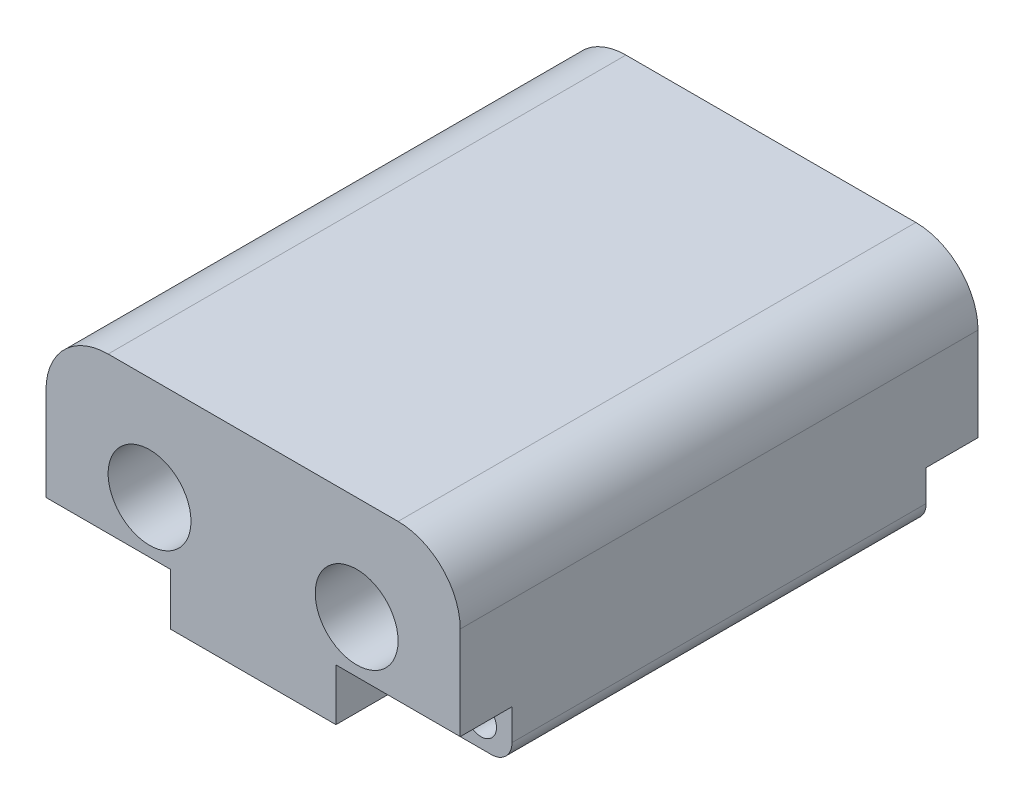
ISO-10303-21;
HEADER;
FILE_DESCRIPTION(('STEP AP214'),'2;1');
FILE_NAME('part.step','',(''),(''),'','','');
FILE_SCHEMA(('AUTOMOTIVE_DESIGN { 1 0 10303 214 1 1 1 1 }'));
ENDSEC;
DATA;
#1=APPLICATION_CONTEXT('core data for automotive mechanical design processes');
#2=APPLICATION_PROTOCOL_DEFINITION('international standard','automotive_design',2000,#1);
#3=PRODUCT_CONTEXT('',#1,'mechanical');
#4=PRODUCT('Part','Part','',(#3));
#5=PRODUCT_RELATED_PRODUCT_CATEGORY('part','',(#4));
#6=PRODUCT_DEFINITION_FORMATION('','',#4);
#7=PRODUCT_DEFINITION_CONTEXT('part definition',#1,'design');
#8=PRODUCT_DEFINITION('design','',#6,#7);
#9=PRODUCT_DEFINITION_SHAPE('','',#8);
#10=(LENGTH_UNIT() NAMED_UNIT(*) SI_UNIT(.MILLI.,.METRE.));
#11=(NAMED_UNIT(*) PLANE_ANGLE_UNIT() SI_UNIT($,.RADIAN.));
#12=(NAMED_UNIT(*) SI_UNIT($,.STERADIAN.) SOLID_ANGLE_UNIT());
#13=UNCERTAINTY_MEASURE_WITH_UNIT(LENGTH_MEASURE(1.E-05),#10,'distance_accuracy_value','');
#14=(GEOMETRIC_REPRESENTATION_CONTEXT(3) GLOBAL_UNCERTAINTY_ASSIGNED_CONTEXT((#13)) GLOBAL_UNIT_ASSIGNED_CONTEXT((#10,
#11,#12)) REPRESENTATION_CONTEXT('',''));
#15=CARTESIAN_POINT('',(0.,0.,0.));
#16=DIRECTION('',(0.,0.,1.));
#17=DIRECTION('',(1.,0.,0.));
#18=AXIS2_PLACEMENT_3D('',#15,#16,#17);
#19=CARTESIAN_POINT('',(0.,0.,0.));
#20=DIRECTION('',(0.,0.,1.));
#21=DIRECTION('',(1.,0.,0.));
#22=AXIS2_PLACEMENT_3D('',#19,#20,#21);
#23=PLANE('',#22);
#24=CARTESIAN_POINT('',(-10.,0.,0.));
#25=DIRECTION('',(0.,0.,1.));
#26=DIRECTION('',(1.,0.,0.));
#27=AXIS2_PLACEMENT_3D('',#24,#25,#26);
#28=CIRCLE('',#27,4.);
#29=CARTESIAN_POINT('',(-6.,0.,0.));
#30=VERTEX_POINT('',#29);
#31=EDGE_CURVE('E299',#30,#30,#28,.T.);
#32=ORIENTED_EDGE('',*,*,#31,.T.);
#33=EDGE_LOOP('',(#32));
#34=FACE_BOUND('',#33,.T.);
#35=CARTESIAN_POINT('',(9.99999999999999,0.,0.));
#36=DIRECTION('',(0.,0.,1.));
#37=DIRECTION('',(1.,0.,0.));
#38=AXIS2_PLACEMENT_3D('',#35,#36,#37);
#39=CIRCLE('',#38,4.);
#40=CARTESIAN_POINT('',(14.,0.,0.));
#41=VERTEX_POINT('',#40);
#42=EDGE_CURVE('E273',#41,#41,#39,.T.);
#43=ORIENTED_EDGE('',*,*,#42,.T.);
#44=EDGE_LOOP('',(#43));
#45=FACE_BOUND('',#44,.T.);
#46=DIRECTION('',(-1.,0.,0.));
#47=VECTOR('',#46,1.);
#48=CARTESIAN_POINT('',(-20.,10.,0.));
#49=LINE('',#48,#47);
#50=CARTESIAN_POINT('',(14.,10.,0.));
#51=VERTEX_POINT('',#50);
#52=CARTESIAN_POINT('',(-14.,10.,0.));
#53=VERTEX_POINT('',#52);
#54=EDGE_CURVE('E323',#51,#53,#49,.T.);
#55=ORIENTED_EDGE('',*,*,#54,.F.);
#56=CARTESIAN_POINT('',(14.,4.00000000000001,0.));
#57=DIRECTION('',(0.,0.,1.));
#58=DIRECTION('',(1.,0.,0.));
#59=AXIS2_PLACEMENT_3D('',#56,#57,#58);
#60=CIRCLE('',#59,6.);
#61=CARTESIAN_POINT('',(20.,4.00000000000001,0.));
#62=VERTEX_POINT('',#61);
#63=EDGE_CURVE('E335',#51,#62,#60,.F.);
#64=ORIENTED_EDGE('',*,*,#63,.T.);
#65=DIRECTION('',(0.,1.,0.));
#66=VECTOR('',#65,1.);
#67=CARTESIAN_POINT('',(20.,10.,0.));
#68=LINE('',#67,#66);
#69=CARTESIAN_POINT('',(20.,-5.,0.));
#70=VERTEX_POINT('',#69);
#71=EDGE_CURVE('E305',#70,#62,#68,.T.);
#72=ORIENTED_EDGE('',*,*,#71,.F.);
#73=DIRECTION('',(-1.,0.,0.));
#74=VECTOR('',#73,1.);
#75=CARTESIAN_POINT('',(20.,-5.,0.));
#76=LINE('',#75,#74);
#77=CARTESIAN_POINT('',(8.,-5.,0.));
#78=VERTEX_POINT('',#77);
#79=EDGE_CURVE('E205',#70,#78,#76,.T.);
#80=ORIENTED_EDGE('',*,*,#79,.T.);
#81=DIRECTION('',(0.,-1.,0.));
#82=VECTOR('',#81,1.);
#83=CARTESIAN_POINT('',(8.00000000000001,-10.,0.));
#84=LINE('',#83,#82);
#85=CARTESIAN_POINT('',(8.00000000000001,-10.,0.));
#86=VERTEX_POINT('',#85);
#87=EDGE_CURVE('E213',#78,#86,#84,.T.);
#88=ORIENTED_EDGE('',*,*,#87,.T.);
#89=DIRECTION('',(1.,0.,0.));
#90=VECTOR('',#89,1.);
#91=CARTESIAN_POINT('',(-20.,-10.,0.));
#92=LINE('',#91,#90);
#93=CARTESIAN_POINT('',(-8.,-10.,0.));
#94=VERTEX_POINT('',#93);
#95=EDGE_CURVE('E312',#94,#86,#92,.T.);
#96=ORIENTED_EDGE('',*,*,#95,.F.);
#97=DIRECTION('',(0.,1.,0.));
#98=VECTOR('',#97,1.);
#99=CARTESIAN_POINT('',(-8.,-10.,0.));
#100=LINE('',#99,#98);
#101=CARTESIAN_POINT('',(-8.,-5.,0.));
#102=VERTEX_POINT('',#101);
#103=EDGE_CURVE('E189',#94,#102,#100,.T.);
#104=ORIENTED_EDGE('',*,*,#103,.T.);
#105=DIRECTION('',(-1.,0.,0.));
#106=VECTOR('',#105,1.);
#107=CARTESIAN_POINT('',(-20.,-5.,0.));
#108=LINE('',#107,#106);
#109=CARTESIAN_POINT('',(-20.,-5.,0.));
#110=VERTEX_POINT('',#109);
#111=EDGE_CURVE('E222',#102,#110,#108,.T.);
#112=ORIENTED_EDGE('',*,*,#111,.T.);
#113=DIRECTION('',(0.,-1.,0.));
#114=VECTOR('',#113,1.);
#115=CARTESIAN_POINT('',(-20.,-10.,0.));
#116=LINE('',#115,#114);
#117=CARTESIAN_POINT('',(-20.,4.,0.));
#118=VERTEX_POINT('',#117);
#119=EDGE_CURVE('E194',#118,#110,#116,.T.);
#120=ORIENTED_EDGE('',*,*,#119,.F.);
#121=CARTESIAN_POINT('',(-14.,4.,0.));
#122=DIRECTION('',(0.,0.,1.));
#123=DIRECTION('',(1.,0.,0.));
#124=AXIS2_PLACEMENT_3D('',#121,#122,#123);
#125=CIRCLE('',#124,6.);
#126=EDGE_CURVE('E333',#118,#53,#125,.F.);
#127=ORIENTED_EDGE('',*,*,#126,.T.);
#128=EDGE_LOOP('',(#55,#64,#72,#80,#88,#96,#104,#112,#120,#127));
#129=FACE_BOUND('',#128,.T.);
#130=ADVANCED_FACE('F33',(#34,#45,#129),#23,.F.);
#131=CARTESIAN_POINT('',(20.,10.,50.));
#132=DIRECTION('',(-1.,0.,0.));
#133=DIRECTION('',(0.,0.,1.));
#134=AXIS2_PLACEMENT_3D('',#131,#132,#133);
#135=PLANE('',#134);
#136=DIRECTION('',(0.,1.,0.));
#137=VECTOR('',#136,1.);
#138=CARTESIAN_POINT('',(20.,-10.,45.));
#139=LINE('',#138,#137);
#140=CARTESIAN_POINT('',(20.,-8.00000000000001,45.));
#141=VERTEX_POINT('',#140);
#142=CARTESIAN_POINT('',(20.,-5.,45.));
#143=VERTEX_POINT('',#142);
#144=EDGE_CURVE('E277',#141,#143,#139,.T.);
#145=ORIENTED_EDGE('',*,*,#144,.F.);
#146=DIRECTION('',(0.,0.,-1.));
#147=VECTOR('',#146,1.);
#148=CARTESIAN_POINT('',(20.,-8.00000000000001,50.));
#149=LINE('',#148,#147);
#150=CARTESIAN_POINT('',(20.,-8.00000000000001,5.));
#151=VERTEX_POINT('',#150);
#152=EDGE_CURVE('E355',#141,#151,#149,.T.);
#153=ORIENTED_EDGE('',*,*,#152,.T.);
#154=DIRECTION('',(0.,1.,0.));
#155=VECTOR('',#154,1.);
#156=CARTESIAN_POINT('',(20.,-10.,5.));
#157=LINE('',#156,#155);
#158=CARTESIAN_POINT('',(20.,-5.,5.));
#159=VERTEX_POINT('',#158);
#160=EDGE_CURVE('E202',#151,#159,#157,.T.);
#161=ORIENTED_EDGE('',*,*,#160,.T.);
#162=DIRECTION('',(0.,0.,-1.));
#163=VECTOR('',#162,1.);
#164=CARTESIAN_POINT('',(20.,-5.,5.));
#165=LINE('',#164,#163);
#166=EDGE_CURVE('E219',#159,#70,#165,.T.);
#167=ORIENTED_EDGE('',*,*,#166,.T.);
#168=ORIENTED_EDGE('',*,*,#71,.T.);
#169=DIRECTION('',(0.,0.,-1.));
#170=VECTOR('',#169,1.);
#171=CARTESIAN_POINT('',(20.,4.00000000000001,50.));
#172=LINE('',#171,#170);
#173=CARTESIAN_POINT('',(20.,4.00000000000001,50.));
#174=VERTEX_POINT('',#173);
#175=EDGE_CURVE('E337',#62,#174,#172,.F.);
#176=ORIENTED_EDGE('',*,*,#175,.T.);
#177=DIRECTION('',(0.,1.,0.));
#178=VECTOR('',#177,1.);
#179=CARTESIAN_POINT('',(20.,10.,50.));
#180=LINE('',#179,#178);
#181=CARTESIAN_POINT('',(20.,-5.,50.));
#182=VERTEX_POINT('',#181);
#183=EDGE_CURVE('E308',#182,#174,#180,.T.);
#184=ORIENTED_EDGE('',*,*,#183,.F.);
#185=DIRECTION('',(0.,0.,1.));
#186=VECTOR('',#185,1.);
#187=CARTESIAN_POINT('',(20.,-5.,45.));
#188=LINE('',#187,#186);
#189=EDGE_CURVE('E287',#143,#182,#188,.T.);
#190=ORIENTED_EDGE('',*,*,#189,.F.);
#191=EDGE_LOOP('',(#145,#153,#161,#167,#168,#176,#184,#190));
#192=FACE_BOUND('',#191,.T.);
#193=ADVANCED_FACE('F368',(#192),#135,.F.);
#194=CARTESIAN_POINT('',(-20.,-10.,50.));
#195=DIRECTION('',(1.,0.,0.));
#196=DIRECTION('',(0.,0.,-1.));
#197=AXIS2_PLACEMENT_3D('',#194,#195,#196);
#198=PLANE('',#197);
#199=DIRECTION('',(0.,-1.,0.));
#200=VECTOR('',#199,1.);
#201=CARTESIAN_POINT('',(-20.,-10.,5.));
#202=LINE('',#201,#200);
#203=CARTESIAN_POINT('',(-20.,-5.,5.));
#204=VERTEX_POINT('',#203);
#205=CARTESIAN_POINT('',(-20.,-8.,5.));
#206=VERTEX_POINT('',#205);
#207=EDGE_CURVE('E181',#204,#206,#202,.T.);
#208=ORIENTED_EDGE('',*,*,#207,.T.);
#209=DIRECTION('',(0.,0.,-1.));
#210=VECTOR('',#209,1.);
#211=CARTESIAN_POINT('',(-20.,-8.,50.));
#212=LINE('',#211,#210);
#213=CARTESIAN_POINT('',(-20.,-8.,45.));
#214=VERTEX_POINT('',#213);
#215=EDGE_CURVE('E351',#206,#214,#212,.F.);
#216=ORIENTED_EDGE('',*,*,#215,.T.);
#217=DIRECTION('',(0.,-1.,0.));
#218=VECTOR('',#217,1.);
#219=CARTESIAN_POINT('',(-20.,-10.,45.));
#220=LINE('',#219,#218);
#221=CARTESIAN_POINT('',(-20.,-5.,45.));
#222=VERTEX_POINT('',#221);
#223=EDGE_CURVE('E251',#222,#214,#220,.T.);
#224=ORIENTED_EDGE('',*,*,#223,.F.);
#225=DIRECTION('',(0.,0.,1.));
#226=VECTOR('',#225,1.);
#227=CARTESIAN_POINT('',(-20.,-5.,45.));
#228=LINE('',#227,#226);
#229=CARTESIAN_POINT('',(-20.,-5.,50.));
#230=VERTEX_POINT('',#229);
#231=EDGE_CURVE('E270',#222,#230,#228,.T.);
#232=ORIENTED_EDGE('',*,*,#231,.T.);
#233=DIRECTION('',(0.,-1.,0.));
#234=VECTOR('',#233,1.);
#235=CARTESIAN_POINT('',(-20.,-10.,50.));
#236=LINE('',#235,#234);
#237=CARTESIAN_POINT('',(-20.,4.,50.));
#238=VERTEX_POINT('',#237);
#239=EDGE_CURVE('E315',#238,#230,#236,.T.);
#240=ORIENTED_EDGE('',*,*,#239,.F.);
#241=DIRECTION('',(0.,0.,-1.));
#242=VECTOR('',#241,1.);
#243=CARTESIAN_POINT('',(-20.,4.,50.));
#244=LINE('',#243,#242);
#245=EDGE_CURVE('E343',#238,#118,#244,.T.);
#246=ORIENTED_EDGE('',*,*,#245,.T.);
#247=ORIENTED_EDGE('',*,*,#119,.T.);
#248=DIRECTION('',(0.,0.,-1.));
#249=VECTOR('',#248,1.);
#250=CARTESIAN_POINT('',(-20.,-5.,5.));
#251=LINE('',#250,#249);
#252=EDGE_CURVE('E175',#204,#110,#251,.T.);
#253=ORIENTED_EDGE('',*,*,#252,.F.);
#254=EDGE_LOOP('',(#208,#216,#224,#232,#240,#246,#247,#253));
#255=FACE_BOUND('',#254,.T.);
#256=ADVANCED_FACE('F191',(#255),#198,.F.);
#257=CARTESIAN_POINT('',(-20.,-10.,50.));
#258=DIRECTION('',(0.,1.,0.));
#259=DIRECTION('',(-1.,0.,0.));
#260=AXIS2_PLACEMENT_3D('',#257,#258,#259);
#261=PLANE('',#260);
#262=DIRECTION('',(1.,0.,0.));
#263=VECTOR('',#262,1.);
#264=CARTESIAN_POINT('',(-20.,-10.,45.));
#265=LINE('',#264,#263);
#266=CARTESIAN_POINT('',(-18.,-10.,45.));
#267=VERTEX_POINT('',#266);
#268=CARTESIAN_POINT('',(-8.,-10.,45.));
#269=VERTEX_POINT('',#268);
#270=EDGE_CURVE('E254',#267,#269,#265,.T.);
#271=ORIENTED_EDGE('',*,*,#270,.F.);
#272=DIRECTION('',(0.,0.,-1.));
#273=VECTOR('',#272,1.);
#274=CARTESIAN_POINT('',(-18.,-10.,50.));
#275=LINE('',#274,#273);
#276=CARTESIAN_POINT('',(-18.,-10.,5.));
#277=VERTEX_POINT('',#276);
#278=EDGE_CURVE('E347',#267,#277,#275,.T.);
#279=ORIENTED_EDGE('',*,*,#278,.T.);
#280=DIRECTION('',(1.,0.,0.));
#281=VECTOR('',#280,1.);
#282=CARTESIAN_POINT('',(-20.,-10.,5.));
#283=LINE('',#282,#281);
#284=CARTESIAN_POINT('',(-8.,-10.,5.));
#285=VERTEX_POINT('',#284);
#286=EDGE_CURVE('E195',#277,#285,#283,.T.);
#287=ORIENTED_EDGE('',*,*,#286,.T.);
#288=DIRECTION('',(0.,0.,-1.));
#289=VECTOR('',#288,1.);
#290=CARTESIAN_POINT('',(-8.,-10.,5.));
#291=LINE('',#290,#289);
#292=EDGE_CURVE('E197',#285,#94,#291,.T.);
#293=ORIENTED_EDGE('',*,*,#292,.T.);
#294=ORIENTED_EDGE('',*,*,#95,.T.);
#295=DIRECTION('',(0.,0.,-1.));
#296=VECTOR('',#295,1.);
#297=CARTESIAN_POINT('',(8.00000000000001,-10.,5.));
#298=LINE('',#297,#296);
#299=CARTESIAN_POINT('',(8.00000000000001,-10.,5.));
#300=VERTEX_POINT('',#299);
#301=EDGE_CURVE('E212',#300,#86,#298,.T.);
#302=ORIENTED_EDGE('',*,*,#301,.F.);
#303=DIRECTION('',(1.,0.,0.));
#304=VECTOR('',#303,1.);
#305=CARTESIAN_POINT('',(20.,-10.,5.));
#306=LINE('',#305,#304);
#307=CARTESIAN_POINT('',(18.,-10.,5.));
#308=VERTEX_POINT('',#307);
#309=EDGE_CURVE('E204',#300,#308,#306,.T.);
#310=ORIENTED_EDGE('',*,*,#309,.T.);
#311=DIRECTION('',(0.,0.,-1.));
#312=VECTOR('',#311,1.);
#313=CARTESIAN_POINT('',(18.,-10.,50.));
#314=LINE('',#313,#312);
#315=CARTESIAN_POINT('',(18.,-10.,45.));
#316=VERTEX_POINT('',#315);
#317=EDGE_CURVE('E345',#308,#316,#314,.F.);
#318=ORIENTED_EDGE('',*,*,#317,.T.);
#319=DIRECTION('',(1.,0.,0.));
#320=VECTOR('',#319,1.);
#321=CARTESIAN_POINT('',(20.,-10.,45.));
#322=LINE('',#321,#320);
#323=CARTESIAN_POINT('',(8.,-10.,45.));
#324=VERTEX_POINT('',#323);
#325=EDGE_CURVE('E285',#324,#316,#322,.T.);
#326=ORIENTED_EDGE('',*,*,#325,.F.);
#327=DIRECTION('',(0.,0.,1.));
#328=VECTOR('',#327,1.);
#329=CARTESIAN_POINT('',(8.00000000000001,-10.,45.));
#330=LINE('',#329,#328);
#331=CARTESIAN_POINT('',(8.00000000000001,-10.,50.));
#332=VERTEX_POINT('',#331);
#333=EDGE_CURVE('E267',#324,#332,#330,.T.);
#334=ORIENTED_EDGE('',*,*,#333,.T.);
#335=DIRECTION('',(1.,0.,0.));
#336=VECTOR('',#335,1.);
#337=CARTESIAN_POINT('',(-20.,-10.,50.));
#338=LINE('',#337,#336);
#339=CARTESIAN_POINT('',(-8.,-10.,50.));
#340=VERTEX_POINT('',#339);
#341=EDGE_CURVE('E317',#340,#332,#338,.T.);
#342=ORIENTED_EDGE('',*,*,#341,.F.);
#343=DIRECTION('',(0.,0.,1.));
#344=VECTOR('',#343,1.);
#345=CARTESIAN_POINT('',(-8.,-10.,45.));
#346=LINE('',#345,#344);
#347=EDGE_CURVE('E263',#269,#340,#346,.T.);
#348=ORIENTED_EDGE('',*,*,#347,.F.);
#349=EDGE_LOOP('',(#271,#279,#287,#293,#294,#302,#310,#318,#326,#334,#342,#348));
#350=FACE_BOUND('',#349,.T.);
#351=ADVANCED_FACE('F365',(#350),#261,.F.);
#352=CARTESIAN_POINT('',(0.,0.,50.));
#353=DIRECTION('',(0.,0.,1.));
#354=DIRECTION('',(1.,0.,0.));
#355=AXIS2_PLACEMENT_3D('',#352,#353,#354);
#356=PLANE('',#355);
#357=ORIENTED_EDGE('',*,*,#183,.T.);
#358=CARTESIAN_POINT('',(14.,4.00000000000001,50.));
#359=DIRECTION('',(0.,0.,1.));
#360=DIRECTION('',(1.,0.,0.));
#361=AXIS2_PLACEMENT_3D('',#358,#359,#360);
#362=CIRCLE('',#361,6.);
#363=CARTESIAN_POINT('',(14.,10.,50.));
#364=VERTEX_POINT('',#363);
#365=EDGE_CURVE('E341',#174,#364,#362,.T.);
#366=ORIENTED_EDGE('',*,*,#365,.T.);
#367=DIRECTION('',(-1.,0.,0.));
#368=VECTOR('',#367,1.);
#369=CARTESIAN_POINT('',(-20.,10.,50.));
#370=LINE('',#369,#368);
#371=CARTESIAN_POINT('',(-14.,10.,50.));
#372=VERTEX_POINT('',#371);
#373=EDGE_CURVE('E311',#364,#372,#370,.T.);
#374=ORIENTED_EDGE('',*,*,#373,.T.);
#375=CARTESIAN_POINT('',(-14.,4.,50.));
#376=DIRECTION('',(0.,0.,1.));
#377=DIRECTION('',(1.,0.,0.));
#378=AXIS2_PLACEMENT_3D('',#375,#376,#377);
#379=CIRCLE('',#378,6.);
#380=EDGE_CURVE('E339',#372,#238,#379,.T.);
#381=ORIENTED_EDGE('',*,*,#380,.T.);
#382=ORIENTED_EDGE('',*,*,#239,.T.);
#383=DIRECTION('',(-1.,0.,0.));
#384=VECTOR('',#383,1.);
#385=CARTESIAN_POINT('',(-20.,-5.,50.));
#386=LINE('',#385,#384);
#387=CARTESIAN_POINT('',(-8.,-5.,50.));
#388=VERTEX_POINT('',#387);
#389=EDGE_CURVE('E255',#388,#230,#386,.T.);
#390=ORIENTED_EDGE('',*,*,#389,.F.);
#391=DIRECTION('',(0.,1.,0.));
#392=VECTOR('',#391,1.);
#393=CARTESIAN_POINT('',(-8.,-10.,50.));
#394=LINE('',#393,#392);
#395=EDGE_CURVE('E264',#340,#388,#394,.T.);
#396=ORIENTED_EDGE('',*,*,#395,.F.);
#397=ORIENTED_EDGE('',*,*,#341,.T.);
#398=DIRECTION('',(0.,-1.,0.));
#399=VECTOR('',#398,1.);
#400=CARTESIAN_POINT('',(8.00000000000001,-10.,50.));
#401=LINE('',#400,#399);
#402=CARTESIAN_POINT('',(8.,-5.,50.));
#403=VERTEX_POINT('',#402);
#404=EDGE_CURVE('E280',#403,#332,#401,.T.);
#405=ORIENTED_EDGE('',*,*,#404,.F.);
#406=DIRECTION('',(-1.,0.,0.));
#407=VECTOR('',#406,1.);
#408=CARTESIAN_POINT('',(20.,-5.,50.));
#409=LINE('',#408,#407);
#410=EDGE_CURVE('E229',#182,#403,#409,.T.);
#411=ORIENTED_EDGE('',*,*,#410,.F.);
#412=EDGE_LOOP('',(#357,#366,#374,#381,#382,#390,#396,#397,#405,#411));
#413=FACE_BOUND('',#412,.T.);
#414=CARTESIAN_POINT('',(-10.,0.,50.));
#415=DIRECTION('',(0.,0.,1.));
#416=DIRECTION('',(1.,0.,0.));
#417=AXIS2_PLACEMENT_3D('',#414,#415,#416);
#418=CIRCLE('',#417,4.);
#419=CARTESIAN_POINT('',(-6.,0.,50.));
#420=VERTEX_POINT('',#419);
#421=EDGE_CURVE('E302',#420,#420,#418,.T.);
#422=ORIENTED_EDGE('',*,*,#421,.F.);
#423=EDGE_LOOP('',(#422));
#424=FACE_BOUND('',#423,.T.);
#425=CARTESIAN_POINT('',(9.99999999999999,0.,50.));
#426=DIRECTION('',(0.,0.,1.));
#427=DIRECTION('',(1.,0.,0.));
#428=AXIS2_PLACEMENT_3D('',#425,#426,#427);
#429=CIRCLE('',#428,4.);
#430=CARTESIAN_POINT('',(14.,0.,50.));
#431=VERTEX_POINT('',#430);
#432=EDGE_CURVE('E296',#431,#431,#429,.T.);
#433=ORIENTED_EDGE('',*,*,#432,.F.);
#434=EDGE_LOOP('',(#433));
#435=FACE_BOUND('',#434,.T.);
#436=ADVANCED_FACE('F385',(#413,#424,#435),#356,.T.);
#437=CARTESIAN_POINT('',(-20.,10.,50.));
#438=DIRECTION('',(0.,-1.,0.));
#439=DIRECTION('',(1.,0.,0.));
#440=AXIS2_PLACEMENT_3D('',#437,#438,#439);
#441=PLANE('',#440);
#442=ORIENTED_EDGE('',*,*,#373,.F.);
#443=DIRECTION('',(0.,0.,-1.));
#444=VECTOR('',#443,1.);
#445=CARTESIAN_POINT('',(14.,10.,50.));
#446=LINE('',#445,#444);
#447=EDGE_CURVE('E330',#364,#51,#446,.T.);
#448=ORIENTED_EDGE('',*,*,#447,.T.);
#449=ORIENTED_EDGE('',*,*,#54,.T.);
#450=DIRECTION('',(0.,0.,-1.));
#451=VECTOR('',#450,1.);
#452=CARTESIAN_POINT('',(-14.,10.,50.));
#453=LINE('',#452,#451);
#454=EDGE_CURVE('E320',#53,#372,#453,.F.);
#455=ORIENTED_EDGE('',*,*,#454,.T.);
#456=EDGE_LOOP('',(#442,#448,#449,#455));
#457=FACE_BOUND('',#456,.T.);
#458=ADVANCED_FACE('F411',(#457),#441,.F.);
#459=CARTESIAN_POINT('',(-10.,0.,50.));
#460=DIRECTION('',(0.,0.,-1.));
#461=DIRECTION('',(-1.,0.,0.));
#462=AXIS2_PLACEMENT_3D('',#459,#460,#461);
#463=CYLINDRICAL_SURFACE('',#462,4.);
#464=ORIENTED_EDGE('',*,*,#421,.T.);
#465=EDGE_LOOP('',(#464));
#466=FACE_BOUND('',#465,.T.);
#467=ORIENTED_EDGE('',*,*,#31,.F.);
#468=EDGE_LOOP('',(#467));
#469=FACE_BOUND('',#468,.T.);
#470=ADVANCED_FACE('F489',(#466,#469),#463,.F.);
#471=CARTESIAN_POINT('',(9.99999999999999,0.,50.));
#472=DIRECTION('',(0.,0.,-1.));
#473=DIRECTION('',(-1.,0.,0.));
#474=AXIS2_PLACEMENT_3D('',#471,#472,#473);
#475=CYLINDRICAL_SURFACE('',#474,4.);
#476=ORIENTED_EDGE('',*,*,#432,.T.);
#477=EDGE_LOOP('',(#476));
#478=FACE_BOUND('',#477,.T.);
#479=ORIENTED_EDGE('',*,*,#42,.F.);
#480=EDGE_LOOP('',(#479));
#481=FACE_BOUND('',#480,.T.);
#482=ADVANCED_FACE('F800',(#478,#481),#475,.F.);
#483=CARTESIAN_POINT('',(8.00000000000001,-10.,45.));
#484=DIRECTION('',(-1.,0.,0.));
#485=DIRECTION('',(0.,-1.,0.));
#486=AXIS2_PLACEMENT_3D('',#483,#484,#485);
#487=PLANE('',#486);
#488=ORIENTED_EDGE('',*,*,#404,.T.);
#489=ORIENTED_EDGE('',*,*,#333,.F.);
#490=DIRECTION('',(0.,-1.,0.));
#491=VECTOR('',#490,1.);
#492=CARTESIAN_POINT('',(8.00000000000001,-10.,45.));
#493=LINE('',#492,#491);
#494=CARTESIAN_POINT('',(8.,-5.,45.));
#495=VERTEX_POINT('',#494);
#496=EDGE_CURVE('E283',#495,#324,#493,.T.);
#497=ORIENTED_EDGE('',*,*,#496,.F.);
#498=DIRECTION('',(0.,0.,1.));
#499=VECTOR('',#498,1.);
#500=CARTESIAN_POINT('',(8.,-5.,45.));
#501=LINE('',#500,#499);
#502=EDGE_CURVE('E293',#495,#403,#501,.T.);
#503=ORIENTED_EDGE('',*,*,#502,.T.);
#504=EDGE_LOOP('',(#488,#489,#497,#503));
#505=FACE_BOUND('',#504,.T.);
#506=ADVANCED_FACE('F380',(#505),#487,.F.);
#507=CARTESIAN_POINT('',(20.,-5.,45.));
#508=DIRECTION('',(0.,1.,0.));
#509=DIRECTION('',(-1.,0.,0.));
#510=AXIS2_PLACEMENT_3D('',#507,#508,#509);
#511=PLANE('',#510);
#512=ORIENTED_EDGE('',*,*,#410,.T.);
#513=ORIENTED_EDGE('',*,*,#502,.F.);
#514=DIRECTION('',(-1.,0.,0.));
#515=VECTOR('',#514,1.);
#516=CARTESIAN_POINT('',(20.,-5.,45.));
#517=LINE('',#516,#515);
#518=EDGE_CURVE('E279',#143,#495,#517,.T.);
#519=ORIENTED_EDGE('',*,*,#518,.F.);
#520=ORIENTED_EDGE('',*,*,#189,.T.);
#521=EDGE_LOOP('',(#512,#513,#519,#520));
#522=FACE_BOUND('',#521,.T.);
#523=ADVANCED_FACE('F374',(#522),#511,.F.);
#524=CARTESIAN_POINT('',(0.,0.,45.));
#525=DIRECTION('',(0.,0.,1.));
#526=DIRECTION('',(1.,0.,0.));
#527=AXIS2_PLACEMENT_3D('',#524,#525,#526);
#528=PLANE('',#527);
#529=CARTESIAN_POINT('',(11.,-7.5,45.));
#530=DIRECTION('',(0.,0.,1.));
#531=DIRECTION('',(1.,0.,0.));
#532=AXIS2_PLACEMENT_3D('',#529,#530,#531);
#533=CIRCLE('',#532,1.5);
#534=CARTESIAN_POINT('',(12.5,-7.5,45.));
#535=VERTEX_POINT('',#534);
#536=EDGE_CURVE('E238',#535,#535,#533,.T.);
#537=ORIENTED_EDGE('',*,*,#536,.F.);
#538=EDGE_LOOP('',(#537));
#539=FACE_BOUND('',#538,.T.);
#540=CARTESIAN_POINT('',(17.,-7.5,45.));
#541=DIRECTION('',(0.,0.,1.));
#542=DIRECTION('',(-1.,0.,0.));
#543=AXIS2_PLACEMENT_3D('',#540,#541,#542);
#544=CIRCLE('',#543,1.5);
#545=CARTESIAN_POINT('',(15.5,-7.5,45.));
#546=VERTEX_POINT('',#545);
#547=EDGE_CURVE('E237',#546,#546,#544,.T.);
#548=ORIENTED_EDGE('',*,*,#547,.F.);
#549=EDGE_LOOP('',(#548));
#550=FACE_BOUND('',#549,.T.);
#551=ORIENTED_EDGE('',*,*,#325,.T.);
#552=CARTESIAN_POINT('',(18.,-8.00000000000001,45.));
#553=DIRECTION('',(0.,0.,1.));
#554=DIRECTION('',(1.,0.,0.));
#555=AXIS2_PLACEMENT_3D('',#552,#553,#554);
#556=CIRCLE('',#555,2.);
#557=EDGE_CURVE('E11',#316,#141,#556,.T.);
#558=ORIENTED_EDGE('',*,*,#557,.T.);
#559=ORIENTED_EDGE('',*,*,#144,.T.);
#560=ORIENTED_EDGE('',*,*,#518,.T.);
#561=ORIENTED_EDGE('',*,*,#496,.T.);
#562=EDGE_LOOP('',(#551,#558,#559,#560,#561));
#563=FACE_BOUND('',#562,.T.);
#564=ADVANCED_FACE('F372',(#539,#550,#563),#528,.T.);
#565=CARTESIAN_POINT('',(-20.,-5.,45.));
#566=DIRECTION('',(0.,1.,0.));
#567=DIRECTION('',(0.,0.,1.));
#568=AXIS2_PLACEMENT_3D('',#565,#566,#567);
#569=PLANE('',#568);
#570=ORIENTED_EDGE('',*,*,#389,.T.);
#571=ORIENTED_EDGE('',*,*,#231,.F.);
#572=DIRECTION('',(-1.,0.,0.));
#573=VECTOR('',#572,1.);
#574=CARTESIAN_POINT('',(-20.,-5.,45.));
#575=LINE('',#574,#573);
#576=CARTESIAN_POINT('',(-8.,-5.,45.));
#577=VERTEX_POINT('',#576);
#578=EDGE_CURVE('E260',#577,#222,#575,.T.);
#579=ORIENTED_EDGE('',*,*,#578,.F.);
#580=DIRECTION('',(0.,0.,1.));
#581=VECTOR('',#580,1.);
#582=CARTESIAN_POINT('',(-8.,-5.,45.));
#583=LINE('',#582,#581);
#584=EDGE_CURVE('E274',#577,#388,#583,.T.);
#585=ORIENTED_EDGE('',*,*,#584,.T.);
#586=EDGE_LOOP('',(#570,#571,#579,#585));
#587=FACE_BOUND('',#586,.T.);
#588=ADVANCED_FACE('F400',(#587),#569,.F.);
#589=CARTESIAN_POINT('',(-8.,-10.,45.));
#590=DIRECTION('',(1.,0.,0.));
#591=DIRECTION('',(0.,0.,-1.));
#592=AXIS2_PLACEMENT_3D('',#589,#590,#591);
#593=PLANE('',#592);
#594=ORIENTED_EDGE('',*,*,#395,.T.);
#595=ORIENTED_EDGE('',*,*,#584,.F.);
#596=DIRECTION('',(0.,1.,0.));
#597=VECTOR('',#596,1.);
#598=CARTESIAN_POINT('',(-8.,-10.,45.));
#599=LINE('',#598,#597);
#600=EDGE_CURVE('E257',#269,#577,#599,.T.);
#601=ORIENTED_EDGE('',*,*,#600,.F.);
#602=ORIENTED_EDGE('',*,*,#347,.T.);
#603=EDGE_LOOP('',(#594,#595,#601,#602));
#604=FACE_BOUND('',#603,.T.);
#605=ADVANCED_FACE('F389',(#604),#593,.F.);
#606=CARTESIAN_POINT('',(0.,0.,45.));
#607=DIRECTION('',(0.,0.,-1.));
#608=DIRECTION('',(-1.,0.,0.));
#609=AXIS2_PLACEMENT_3D('',#606,#607,#608);
#610=PLANE('',#609);
#611=CARTESIAN_POINT('',(-17.,-7.5,45.));
#612=DIRECTION('',(0.,0.,1.));
#613=DIRECTION('',(1.,0.,0.));
#614=AXIS2_PLACEMENT_3D('',#611,#612,#613);
#615=CIRCLE('',#614,1.5);
#616=CARTESIAN_POINT('',(-15.5,-7.5,45.));
#617=VERTEX_POINT('',#616);
#618=EDGE_CURVE('E230',#617,#617,#615,.T.);
#619=ORIENTED_EDGE('',*,*,#618,.F.);
#620=EDGE_LOOP('',(#619));
#621=FACE_BOUND('',#620,.T.);
#622=CARTESIAN_POINT('',(-11.,-7.5,45.));
#623=DIRECTION('',(0.,0.,1.));
#624=DIRECTION('',(-1.,0.,0.));
#625=AXIS2_PLACEMENT_3D('',#622,#623,#624);
#626=CIRCLE('',#625,1.5);
#627=CARTESIAN_POINT('',(-12.5,-7.5,45.));
#628=VERTEX_POINT('',#627);
#629=EDGE_CURVE('E243',#628,#628,#626,.T.);
#630=ORIENTED_EDGE('',*,*,#629,.F.);
#631=EDGE_LOOP('',(#630));
#632=FACE_BOUND('',#631,.T.);
#633=ORIENTED_EDGE('',*,*,#223,.T.);
#634=CARTESIAN_POINT('',(-18.,-8.,45.));
#635=DIRECTION('',(0.,0.,-1.));
#636=DIRECTION('',(-1.,0.,0.));
#637=AXIS2_PLACEMENT_3D('',#634,#635,#636);
#638=CIRCLE('',#637,2.);
#639=EDGE_CURVE('E353',#214,#267,#638,.F.);
#640=ORIENTED_EDGE('',*,*,#639,.T.);
#641=ORIENTED_EDGE('',*,*,#270,.T.);
#642=ORIENTED_EDGE('',*,*,#600,.T.);
#643=ORIENTED_EDGE('',*,*,#578,.T.);
#644=EDGE_LOOP('',(#633,#640,#641,#642,#643));
#645=FACE_BOUND('',#644,.T.);
#646=ADVANCED_FACE('F397',(#621,#632,#645),#610,.F.);
#647=CARTESIAN_POINT('',(-11.,-7.5,37.));
#648=DIRECTION('',(0.,0.,1.));
#649=DIRECTION('',(1.,0.,0.));
#650=AXIS2_PLACEMENT_3D('',#647,#648,#649);
#651=CYLINDRICAL_SURFACE('',#650,1.5);
#652=CARTESIAN_POINT('',(-11.,-7.5,37.));
#653=DIRECTION('',(0.,0.,1.));
#654=DIRECTION('',(-1.,0.,0.));
#655=AXIS2_PLACEMENT_3D('',#652,#653,#654);
#656=CIRCLE('',#655,1.5);
#657=CARTESIAN_POINT('',(-12.5,-7.5,37.));
#658=VERTEX_POINT('',#657);
#659=EDGE_CURVE('E233',#658,#658,#656,.T.);
#660=ORIENTED_EDGE('',*,*,#659,.F.);
#661=EDGE_LOOP('',(#660));
#662=FACE_BOUND('',#661,.T.);
#663=ORIENTED_EDGE('',*,*,#629,.T.);
#664=EDGE_LOOP('',(#663));
#665=FACE_BOUND('',#664,.T.);
#666=ADVANCED_FACE('F544',(#662,#665),#651,.F.);
#667=CARTESIAN_POINT('',(-11.,-7.5,37.));
#668=DIRECTION('',(0.,0.,-1.));
#669=DIRECTION('',(-1.,0.,0.));
#670=AXIS2_PLACEMENT_3D('',#667,#668,#669);
#671=PLANE('',#670);
#672=ORIENTED_EDGE('',*,*,#659,.T.);
#673=EDGE_LOOP('',(#672));
#674=FACE_BOUND('',#673,.T.);
#675=ADVANCED_FACE('F756',(#674),#671,.F.);
#676=CARTESIAN_POINT('',(-17.,-7.5,37.));
#677=DIRECTION('',(0.,0.,1.));
#678=DIRECTION('',(1.,0.,0.));
#679=AXIS2_PLACEMENT_3D('',#676,#677,#678);
#680=CYLINDRICAL_SURFACE('',#679,1.5);
#681=CARTESIAN_POINT('',(-17.,-7.5,37.));
#682=DIRECTION('',(0.,0.,1.));
#683=DIRECTION('',(1.,0.,0.));
#684=AXIS2_PLACEMENT_3D('',#681,#682,#683);
#685=CIRCLE('',#684,1.5);
#686=CARTESIAN_POINT('',(-15.5,-7.5,37.));
#687=VERTEX_POINT('',#686);
#688=EDGE_CURVE('E226',#687,#687,#685,.T.);
#689=ORIENTED_EDGE('',*,*,#688,.F.);
#690=EDGE_LOOP('',(#689));
#691=FACE_BOUND('',#690,.T.);
#692=ORIENTED_EDGE('',*,*,#618,.T.);
#693=EDGE_LOOP('',(#692));
#694=FACE_BOUND('',#693,.T.);
#695=ADVANCED_FACE('F746',(#691,#694),#680,.F.);
#696=CARTESIAN_POINT('',(-17.,-7.5,37.));
#697=DIRECTION('',(0.,0.,1.));
#698=DIRECTION('',(1.,0.,0.));
#699=AXIS2_PLACEMENT_3D('',#696,#697,#698);
#700=PLANE('',#699);
#701=ORIENTED_EDGE('',*,*,#688,.T.);
#702=EDGE_LOOP('',(#701));
#703=FACE_BOUND('',#702,.T.);
#704=ADVANCED_FACE('F736',(#703),#700,.T.);
#705=CARTESIAN_POINT('',(17.,-7.5,37.));
#706=DIRECTION('',(0.,0.,1.));
#707=DIRECTION('',(1.,0.,0.));
#708=AXIS2_PLACEMENT_3D('',#705,#706,#707);
#709=CYLINDRICAL_SURFACE('',#708,1.5);
#710=CARTESIAN_POINT('',(17.,-7.5,37.));
#711=DIRECTION('',(0.,0.,1.));
#712=DIRECTION('',(-1.,0.,0.));
#713=AXIS2_PLACEMENT_3D('',#710,#711,#712);
#714=CIRCLE('',#713,1.5);
#715=CARTESIAN_POINT('',(15.5,-7.5,37.));
#716=VERTEX_POINT('',#715);
#717=EDGE_CURVE('E246',#716,#716,#714,.T.);
#718=ORIENTED_EDGE('',*,*,#717,.F.);
#719=EDGE_LOOP('',(#718));
#720=FACE_BOUND('',#719,.T.);
#721=ORIENTED_EDGE('',*,*,#547,.T.);
#722=EDGE_LOOP('',(#721));
#723=FACE_BOUND('',#722,.T.);
#724=ADVANCED_FACE('F726',(#720,#723),#709,.F.);
#725=CARTESIAN_POINT('',(17.,-7.5,37.));
#726=DIRECTION('',(0.,0.,-1.));
#727=DIRECTION('',(-1.,0.,0.));
#728=AXIS2_PLACEMENT_3D('',#725,#726,#727);
#729=PLANE('',#728);
#730=ORIENTED_EDGE('',*,*,#717,.T.);
#731=EDGE_LOOP('',(#730));
#732=FACE_BOUND('',#731,.T.);
#733=ADVANCED_FACE('F716',(#732),#729,.F.);
#734=CARTESIAN_POINT('',(11.,-7.5,37.));
#735=DIRECTION('',(0.,0.,1.));
#736=DIRECTION('',(1.,0.,0.));
#737=AXIS2_PLACEMENT_3D('',#734,#735,#736);
#738=CYLINDRICAL_SURFACE('',#737,1.5);
#739=CARTESIAN_POINT('',(11.,-7.5,37.));
#740=DIRECTION('',(0.,0.,1.));
#741=DIRECTION('',(1.,0.,0.));
#742=AXIS2_PLACEMENT_3D('',#739,#740,#741);
#743=CIRCLE('',#742,1.5);
#744=CARTESIAN_POINT('',(12.5,-7.5,37.));
#745=VERTEX_POINT('',#744);
#746=EDGE_CURVE('E234',#745,#745,#743,.T.);
#747=ORIENTED_EDGE('',*,*,#746,.F.);
#748=EDGE_LOOP('',(#747));
#749=FACE_BOUND('',#748,.T.);
#750=ORIENTED_EDGE('',*,*,#536,.T.);
#751=EDGE_LOOP('',(#750));
#752=FACE_BOUND('',#751,.T.);
#753=ADVANCED_FACE('F706',(#749,#752),#738,.F.);
#754=CARTESIAN_POINT('',(11.,-7.5,37.));
#755=DIRECTION('',(0.,0.,1.));
#756=DIRECTION('',(1.,0.,0.));
#757=AXIS2_PLACEMENT_3D('',#754,#755,#756);
#758=PLANE('',#757);
#759=ORIENTED_EDGE('',*,*,#746,.T.);
#760=EDGE_LOOP('',(#759));
#761=FACE_BOUND('',#760,.T.);
#762=ADVANCED_FACE('F698',(#761),#758,.T.);
#763=CARTESIAN_POINT('',(20.,-5.,5.));
#764=DIRECTION('',(0.,-1.,0.));
#765=DIRECTION('',(1.,0.,0.));
#766=AXIS2_PLACEMENT_3D('',#763,#764,#765);
#767=PLANE('',#766);
#768=ORIENTED_EDGE('',*,*,#79,.F.);
#769=ORIENTED_EDGE('',*,*,#166,.F.);
#770=DIRECTION('',(-1.,0.,0.));
#771=VECTOR('',#770,1.);
#772=CARTESIAN_POINT('',(20.,-5.,5.));
#773=LINE('',#772,#771);
#774=CARTESIAN_POINT('',(8.,-5.,5.));
#775=VERTEX_POINT('',#774);
#776=EDGE_CURVE('E210',#159,#775,#773,.T.);
#777=ORIENTED_EDGE('',*,*,#776,.T.);
#778=DIRECTION('',(0.,0.,-1.));
#779=VECTOR('',#778,1.);
#780=CARTESIAN_POINT('',(8.,-5.,5.));
#781=LINE('',#780,#779);
#782=EDGE_CURVE('E223',#775,#78,#781,.T.);
#783=ORIENTED_EDGE('',*,*,#782,.T.);
#784=EDGE_LOOP('',(#768,#769,#777,#783));
#785=FACE_BOUND('',#784,.T.);
#786=ADVANCED_FACE('F420',(#785),#767,.T.);
#787=CARTESIAN_POINT('',(8.00000000000001,-10.,5.));
#788=DIRECTION('',(1.,0.,0.));
#789=DIRECTION('',(0.,1.,0.));
#790=AXIS2_PLACEMENT_3D('',#787,#788,#789);
#791=PLANE('',#790);
#792=ORIENTED_EDGE('',*,*,#87,.F.);
#793=ORIENTED_EDGE('',*,*,#782,.F.);
#794=DIRECTION('',(0.,-1.,0.));
#795=VECTOR('',#794,1.);
#796=CARTESIAN_POINT('',(8.00000000000001,-10.,5.));
#797=LINE('',#796,#795);
#798=EDGE_CURVE('E208',#775,#300,#797,.T.);
#799=ORIENTED_EDGE('',*,*,#798,.T.);
#800=ORIENTED_EDGE('',*,*,#301,.T.);
#801=EDGE_LOOP('',(#792,#793,#799,#800));
#802=FACE_BOUND('',#801,.T.);
#803=ADVANCED_FACE('F530',(#802),#791,.T.);
#804=CARTESIAN_POINT('',(0.,0.,5.));
#805=DIRECTION('',(0.,0.,-1.));
#806=DIRECTION('',(1.,0.,0.));
#807=AXIS2_PLACEMENT_3D('',#804,#805,#806);
#808=PLANE('',#807);
#809=CARTESIAN_POINT('',(11.,-7.5,5.));
#810=DIRECTION('',(0.,0.,1.));
#811=DIRECTION('',(1.,0.,0.));
#812=AXIS2_PLACEMENT_3D('',#809,#810,#811);
#813=CIRCLE('',#812,1.5);
#814=CARTESIAN_POINT('',(12.5,-7.5,5.));
#815=VERTEX_POINT('',#814);
#816=EDGE_CURVE('E447',#815,#815,#813,.T.);
#817=ORIENTED_EDGE('',*,*,#816,.T.);
#818=EDGE_LOOP('',(#817));
#819=FACE_BOUND('',#818,.T.);
#820=CARTESIAN_POINT('',(17.,-7.5,5.));
#821=DIRECTION('',(0.,0.,1.));
#822=DIRECTION('',(-1.,0.,0.));
#823=AXIS2_PLACEMENT_3D('',#820,#821,#822);
#824=CIRCLE('',#823,1.5);
#825=CARTESIAN_POINT('',(15.5,-7.5,5.));
#826=VERTEX_POINT('',#825);
#827=EDGE_CURVE('E433',#826,#826,#824,.T.);
#828=ORIENTED_EDGE('',*,*,#827,.T.);
#829=EDGE_LOOP('',(#828));
#830=FACE_BOUND('',#829,.T.);
#831=ORIENTED_EDGE('',*,*,#160,.F.);
#832=CARTESIAN_POINT('',(18.,-8.00000000000001,5.));
#833=DIRECTION('',(0.,0.,-1.));
#834=DIRECTION('',(-1.,0.,0.));
#835=AXIS2_PLACEMENT_3D('',#832,#833,#834);
#836=CIRCLE('',#835,2.);
#837=EDGE_CURVE('E41',#151,#308,#836,.T.);
#838=ORIENTED_EDGE('',*,*,#837,.T.);
#839=ORIENTED_EDGE('',*,*,#309,.F.);
#840=ORIENTED_EDGE('',*,*,#798,.F.);
#841=ORIENTED_EDGE('',*,*,#776,.F.);
#842=EDGE_LOOP('',(#831,#838,#839,#840,#841));
#843=FACE_BOUND('',#842,.T.);
#844=ADVANCED_FACE('F359',(#819,#830,#843),#808,.T.);
#845=CARTESIAN_POINT('',(-8.,-10.,5.));
#846=DIRECTION('',(-1.,0.,0.));
#847=DIRECTION('',(0.,0.,1.));
#848=AXIS2_PLACEMENT_3D('',#845,#846,#847);
#849=PLANE('',#848);
#850=ORIENTED_EDGE('',*,*,#103,.F.);
#851=ORIENTED_EDGE('',*,*,#292,.F.);
#852=DIRECTION('',(0.,1.,0.));
#853=VECTOR('',#852,1.);
#854=CARTESIAN_POINT('',(-8.,-10.,5.));
#855=LINE('',#854,#853);
#856=CARTESIAN_POINT('',(-8.,-5.,5.));
#857=VERTEX_POINT('',#856);
#858=EDGE_CURVE('E180',#285,#857,#855,.T.);
#859=ORIENTED_EDGE('',*,*,#858,.T.);
#860=DIRECTION('',(0.,0.,-1.));
#861=VECTOR('',#860,1.);
#862=CARTESIAN_POINT('',(-8.,-5.,5.));
#863=LINE('',#862,#861);
#864=EDGE_CURVE('E177',#857,#102,#863,.T.);
#865=ORIENTED_EDGE('',*,*,#864,.T.);
#866=EDGE_LOOP('',(#850,#851,#859,#865));
#867=FACE_BOUND('',#866,.T.);
#868=ADVANCED_FACE('F529',(#867),#849,.T.);
#869=CARTESIAN_POINT('',(-20.,-5.,5.));
#870=DIRECTION('',(0.,-1.,0.));
#871=DIRECTION('',(0.,0.,-1.));
#872=AXIS2_PLACEMENT_3D('',#869,#870,#871);
#873=PLANE('',#872);
#874=ORIENTED_EDGE('',*,*,#111,.F.);
#875=ORIENTED_EDGE('',*,*,#864,.F.);
#876=DIRECTION('',(-1.,0.,0.));
#877=VECTOR('',#876,1.);
#878=CARTESIAN_POINT('',(-20.,-5.,5.));
#879=LINE('',#878,#877);
#880=EDGE_CURVE('E170',#857,#204,#879,.T.);
#881=ORIENTED_EDGE('',*,*,#880,.T.);
#882=ORIENTED_EDGE('',*,*,#252,.T.);
#883=EDGE_LOOP('',(#874,#875,#881,#882));
#884=FACE_BOUND('',#883,.T.);
#885=ADVANCED_FACE('F173',(#884),#873,.T.);
#886=CARTESIAN_POINT('',(0.,0.,5.));
#887=DIRECTION('',(0.,0.,1.));
#888=DIRECTION('',(-1.,0.,0.));
#889=AXIS2_PLACEMENT_3D('',#886,#887,#888);
#890=PLANE('',#889);
#891=CARTESIAN_POINT('',(-17.,-7.5,5.));
#892=DIRECTION('',(0.,0.,1.));
#893=DIRECTION('',(1.,0.,0.));
#894=AXIS2_PLACEMENT_3D('',#891,#892,#893);
#895=CIRCLE('',#894,1.5);
#896=CARTESIAN_POINT('',(-15.5,-7.5,5.));
#897=VERTEX_POINT('',#896);
#898=EDGE_CURVE('E446',#897,#897,#895,.T.);
#899=ORIENTED_EDGE('',*,*,#898,.T.);
#900=EDGE_LOOP('',(#899));
#901=FACE_BOUND('',#900,.T.);
#902=CARTESIAN_POINT('',(-11.,-7.5,5.));
#903=DIRECTION('',(0.,0.,1.));
#904=DIRECTION('',(-1.,0.,0.));
#905=AXIS2_PLACEMENT_3D('',#902,#903,#904);
#906=CIRCLE('',#905,1.5);
#907=CARTESIAN_POINT('',(-12.5,-7.5,5.));
#908=VERTEX_POINT('',#907);
#909=EDGE_CURVE('E440',#908,#908,#906,.T.);
#910=ORIENTED_EDGE('',*,*,#909,.T.);
#911=EDGE_LOOP('',(#910));
#912=FACE_BOUND('',#911,.T.);
#913=ORIENTED_EDGE('',*,*,#286,.F.);
#914=CARTESIAN_POINT('',(-18.,-8.,5.));
#915=DIRECTION('',(0.,0.,1.));
#916=DIRECTION('',(1.,0.,0.));
#917=AXIS2_PLACEMENT_3D('',#914,#915,#916);
#918=CIRCLE('',#917,2.);
#919=EDGE_CURVE('E186',#277,#206,#918,.F.);
#920=ORIENTED_EDGE('',*,*,#919,.T.);
#921=ORIENTED_EDGE('',*,*,#207,.F.);
#922=ORIENTED_EDGE('',*,*,#880,.F.);
#923=ORIENTED_EDGE('',*,*,#858,.F.);
#924=EDGE_LOOP('',(#913,#920,#921,#922,#923));
#925=FACE_BOUND('',#924,.T.);
#926=ADVANCED_FACE('F185',(#901,#912,#925),#890,.F.);
#927=CARTESIAN_POINT('',(-11.,-7.5,13.));
#928=DIRECTION('',(0.,0.,-1.));
#929=DIRECTION('',(-1.,0.,0.));
#930=AXIS2_PLACEMENT_3D('',#927,#928,#929);
#931=CYLINDRICAL_SURFACE('',#930,1.5);
#932=CARTESIAN_POINT('',(-11.,-7.5,13.));
#933=DIRECTION('',(0.,0.,1.));
#934=DIRECTION('',(-1.,0.,0.));
#935=AXIS2_PLACEMENT_3D('',#932,#933,#934);
#936=CIRCLE('',#935,1.5);
#937=CARTESIAN_POINT('',(-12.5,-7.5,13.));
#938=VERTEX_POINT('',#937);
#939=EDGE_CURVE('E443',#938,#938,#936,.T.);
#940=ORIENTED_EDGE('',*,*,#939,.T.);
#941=EDGE_LOOP('',(#940));
#942=FACE_BOUND('',#941,.T.);
#943=ORIENTED_EDGE('',*,*,#909,.F.);
#944=EDGE_LOOP('',(#943));
#945=FACE_BOUND('',#944,.T.);
#946=ADVANCED_FACE('F515',(#942,#945),#931,.F.);
#947=CARTESIAN_POINT('',(-11.,-7.5,13.));
#948=DIRECTION('',(0.,0.,1.));
#949=DIRECTION('',(-1.,0.,0.));
#950=AXIS2_PLACEMENT_3D('',#947,#948,#949);
#951=PLANE('',#950);
#952=ORIENTED_EDGE('',*,*,#939,.F.);
#953=EDGE_LOOP('',(#952));
#954=FACE_BOUND('',#953,.T.);
#955=ADVANCED_FACE('F471',(#954),#951,.F.);
#956=CARTESIAN_POINT('',(-17.,-7.5,13.));
#957=DIRECTION('',(0.,0.,-1.));
#958=DIRECTION('',(-1.,0.,0.));
#959=AXIS2_PLACEMENT_3D('',#956,#957,#958);
#960=CYLINDRICAL_SURFACE('',#959,1.5);
#961=CARTESIAN_POINT('',(-17.,-7.5,13.));
#962=DIRECTION('',(0.,0.,1.));
#963=DIRECTION('',(1.,0.,0.));
#964=AXIS2_PLACEMENT_3D('',#961,#962,#963);
#965=CIRCLE('',#964,1.5);
#966=CARTESIAN_POINT('',(-15.5,-7.5,13.));
#967=VERTEX_POINT('',#966);
#968=EDGE_CURVE('E216',#967,#967,#965,.T.);
#969=ORIENTED_EDGE('',*,*,#968,.T.);
#970=EDGE_LOOP('',(#969));
#971=FACE_BOUND('',#970,.T.);
#972=ORIENTED_EDGE('',*,*,#898,.F.);
#973=EDGE_LOOP('',(#972));
#974=FACE_BOUND('',#973,.T.);
#975=ADVANCED_FACE('F457',(#971,#974),#960,.F.);
#976=CARTESIAN_POINT('',(-17.,-7.5,13.));
#977=DIRECTION('',(0.,0.,-1.));
#978=DIRECTION('',(1.,0.,0.));
#979=AXIS2_PLACEMENT_3D('',#976,#977,#978);
#980=PLANE('',#979);
#981=ORIENTED_EDGE('',*,*,#968,.F.);
#982=EDGE_LOOP('',(#981));
#983=FACE_BOUND('',#982,.T.);
#984=ADVANCED_FACE('F460',(#983),#980,.T.);
#985=CARTESIAN_POINT('',(17.,-7.5,13.));
#986=DIRECTION('',(0.,0.,-1.));
#987=DIRECTION('',(-1.,0.,0.));
#988=AXIS2_PLACEMENT_3D('',#985,#986,#987);
#989=CYLINDRICAL_SURFACE('',#988,1.5);
#990=CARTESIAN_POINT('',(17.,-7.5,13.));
#991=DIRECTION('',(0.,0.,1.));
#992=DIRECTION('',(-1.,0.,0.));
#993=AXIS2_PLACEMENT_3D('',#990,#991,#992);
#994=CIRCLE('',#993,1.5);
#995=CARTESIAN_POINT('',(15.5,-7.5,13.));
#996=VERTEX_POINT('',#995);
#997=EDGE_CURVE('E436',#996,#996,#994,.T.);
#998=ORIENTED_EDGE('',*,*,#997,.T.);
#999=EDGE_LOOP('',(#998));
#1000=FACE_BOUND('',#999,.T.);
#1001=ORIENTED_EDGE('',*,*,#827,.F.);
#1002=EDGE_LOOP('',(#1001));
#1003=FACE_BOUND('',#1002,.T.);
#1004=ADVANCED_FACE('F462',(#1000,#1003),#989,.F.);
#1005=CARTESIAN_POINT('',(17.,-7.5,13.));
#1006=DIRECTION('',(0.,0.,1.));
#1007=DIRECTION('',(-1.,0.,0.));
#1008=AXIS2_PLACEMENT_3D('',#1005,#1006,#1007);
#1009=PLANE('',#1008);
#1010=ORIENTED_EDGE('',*,*,#997,.F.);
#1011=EDGE_LOOP('',(#1010));
#1012=FACE_BOUND('',#1011,.T.);
#1013=ADVANCED_FACE('F468',(#1012),#1009,.F.);
#1014=CARTESIAN_POINT('',(11.,-7.5,13.));
#1015=DIRECTION('',(0.,0.,-1.));
#1016=DIRECTION('',(-1.,0.,0.));
#1017=AXIS2_PLACEMENT_3D('',#1014,#1015,#1016);
#1018=CYLINDRICAL_SURFACE('',#1017,1.5);
#1019=CARTESIAN_POINT('',(11.,-7.5,13.));
#1020=DIRECTION('',(0.,0.,1.));
#1021=DIRECTION('',(1.,0.,0.));
#1022=AXIS2_PLACEMENT_3D('',#1019,#1020,#1021);
#1023=CIRCLE('',#1022,1.5);
#1024=CARTESIAN_POINT('',(12.5,-7.5,13.));
#1025=VERTEX_POINT('',#1024);
#1026=EDGE_CURVE('E437',#1025,#1025,#1023,.T.);
#1027=ORIENTED_EDGE('',*,*,#1026,.T.);
#1028=EDGE_LOOP('',(#1027));
#1029=FACE_BOUND('',#1028,.T.);
#1030=ORIENTED_EDGE('',*,*,#816,.F.);
#1031=EDGE_LOOP('',(#1030));
#1032=FACE_BOUND('',#1031,.T.);
#1033=ADVANCED_FACE('F621',(#1029,#1032),#1018,.F.);
#1034=CARTESIAN_POINT('',(11.,-7.5,13.));
#1035=DIRECTION('',(0.,0.,-1.));
#1036=DIRECTION('',(1.,0.,0.));
#1037=AXIS2_PLACEMENT_3D('',#1034,#1035,#1036);
#1038=PLANE('',#1037);
#1039=ORIENTED_EDGE('',*,*,#1026,.F.);
#1040=EDGE_LOOP('',(#1039));
#1041=FACE_BOUND('',#1040,.T.);
#1042=ADVANCED_FACE('F493',(#1041),#1038,.T.);
#1043=CARTESIAN_POINT('',(14.,4.00000000000001,50.));
#1044=DIRECTION('',(0.,0.,-1.));
#1045=DIRECTION('',(-1.,0.,0.));
#1046=AXIS2_PLACEMENT_3D('',#1043,#1044,#1045);
#1047=CYLINDRICAL_SURFACE('',#1046,6.);
#1048=ORIENTED_EDGE('',*,*,#365,.F.);
#1049=ORIENTED_EDGE('',*,*,#175,.F.);
#1050=ORIENTED_EDGE('',*,*,#63,.F.);
#1051=ORIENTED_EDGE('',*,*,#447,.F.);
#1052=EDGE_LOOP('',(#1048,#1049,#1050,#1051));
#1053=FACE_BOUND('',#1052,.T.);
#1054=ADVANCED_FACE('F415',(#1053),#1047,.T.);
#1055=CARTESIAN_POINT('',(-14.,4.,50.));
#1056=DIRECTION('',(0.,0.,-1.));
#1057=DIRECTION('',(-1.,0.,0.));
#1058=AXIS2_PLACEMENT_3D('',#1055,#1056,#1057);
#1059=CYLINDRICAL_SURFACE('',#1058,6.);
#1060=ORIENTED_EDGE('',*,*,#380,.F.);
#1061=ORIENTED_EDGE('',*,*,#454,.F.);
#1062=ORIENTED_EDGE('',*,*,#126,.F.);
#1063=ORIENTED_EDGE('',*,*,#245,.F.);
#1064=EDGE_LOOP('',(#1060,#1061,#1062,#1063));
#1065=FACE_BOUND('',#1064,.T.);
#1066=ADVANCED_FACE('F405',(#1065),#1059,.T.);
#1067=CARTESIAN_POINT('',(-18.,-8.,50.));
#1068=DIRECTION('',(0.,0.,-1.));
#1069=DIRECTION('',(-1.,0.,0.));
#1070=AXIS2_PLACEMENT_3D('',#1067,#1068,#1069);
#1071=CYLINDRICAL_SURFACE('',#1070,2.);
#1072=ORIENTED_EDGE('',*,*,#639,.F.);
#1073=ORIENTED_EDGE('',*,*,#215,.F.);
#1074=ORIENTED_EDGE('',*,*,#919,.F.);
#1075=ORIENTED_EDGE('',*,*,#278,.F.);
#1076=EDGE_LOOP('',(#1072,#1073,#1074,#1075));
#1077=FACE_BOUND('',#1076,.T.);
#1078=ADVANCED_FACE('F395',(#1077),#1071,.T.);
#1079=CARTESIAN_POINT('',(18.,-8.00000000000001,50.));
#1080=DIRECTION('',(0.,0.,-1.));
#1081=DIRECTION('',(-1.,0.,0.));
#1082=AXIS2_PLACEMENT_3D('',#1079,#1080,#1081);
#1083=CYLINDRICAL_SURFACE('',#1082,2.);
#1084=ORIENTED_EDGE('',*,*,#557,.F.);
#1085=ORIENTED_EDGE('',*,*,#317,.F.);
#1086=ORIENTED_EDGE('',*,*,#837,.F.);
#1087=ORIENTED_EDGE('',*,*,#152,.F.);
#1088=EDGE_LOOP('',(#1084,#1085,#1086,#1087));
#1089=FACE_BOUND('',#1088,.T.);
#1090=ADVANCED_FACE('F35',(#1089),#1083,.T.);
#1091=CLOSED_SHELL('',(#130,#193,#256,#351,#436,#458,#470,#482,#506,#523,#564,#588,#605,#646,
#666,#675,#695,#704,#724,#733,#753,#762,#786,#803,#844,#868,#885,#926,#946,#955,#975,#984,#1004,
#1013,#1033,#1042,#1054,#1066,#1078,#1090));
#1092=MANIFOLD_SOLID_BREP('B2',#1091);
#1093=ADVANCED_BREP_SHAPE_REPRESENTATION('',(#18,#1092),#14);
#1094=SHAPE_DEFINITION_REPRESENTATION(#9,#1093);
ENDSEC;
END-ISO-10303-21;
